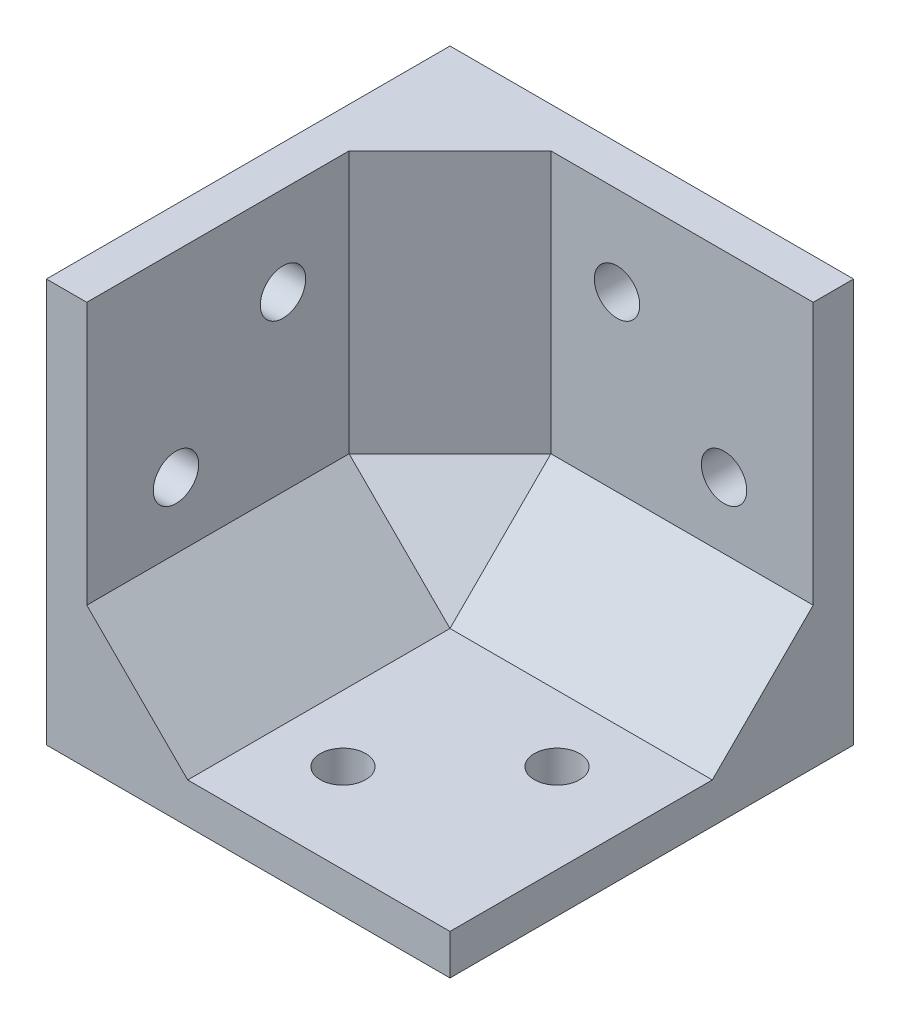
ISO-10303-21;
HEADER;
FILE_DESCRIPTION(('STEP AP214'),'2;1');
FILE_NAME('part.step','',(''),(''),'','','');
FILE_SCHEMA(('AUTOMOTIVE_DESIGN { 1 0 10303 214 1 1 1 1 }'));
ENDSEC;
DATA;
#1=APPLICATION_CONTEXT('core data for automotive mechanical design processes');
#2=APPLICATION_PROTOCOL_DEFINITION('international standard','automotive_design',2000,#1);
#3=PRODUCT_CONTEXT('',#1,'mechanical');
#4=PRODUCT('Part','Part','',(#3));
#5=PRODUCT_RELATED_PRODUCT_CATEGORY('part','',(#4));
#6=PRODUCT_DEFINITION_FORMATION('','',#4);
#7=PRODUCT_DEFINITION_CONTEXT('part definition',#1,'design');
#8=PRODUCT_DEFINITION('design','',#6,#7);
#9=PRODUCT_DEFINITION_SHAPE('','',#8);
#10=(LENGTH_UNIT() NAMED_UNIT(*) SI_UNIT(.MILLI.,.METRE.));
#11=(NAMED_UNIT(*) PLANE_ANGLE_UNIT() SI_UNIT($,.RADIAN.));
#12=(NAMED_UNIT(*) SI_UNIT($,.STERADIAN.) SOLID_ANGLE_UNIT());
#13=UNCERTAINTY_MEASURE_WITH_UNIT(LENGTH_MEASURE(1.E-05),#10,'distance_accuracy_value','');
#14=(GEOMETRIC_REPRESENTATION_CONTEXT(3) GLOBAL_UNCERTAINTY_ASSIGNED_CONTEXT((#13)) GLOBAL_UNIT_ASSIGNED_CONTEXT((#10,
#11,#12)) REPRESENTATION_CONTEXT('',''));
#15=CARTESIAN_POINT('',(0.,0.,0.));
#16=DIRECTION('',(0.,0.,1.));
#17=DIRECTION('',(1.,0.,0.));
#18=AXIS2_PLACEMENT_3D('',#15,#16,#17);
#19=CARTESIAN_POINT('',(0.,4.,0.));
#20=DIRECTION('',(-1.,0.,0.));
#21=DIRECTION('',(0.,0.,1.));
#22=AXIS2_PLACEMENT_3D('',#19,#20,#21);
#23=PLANE('',#22);
#24=DIRECTION('',(0.,0.,-1.));
#25=VECTOR('',#24,1.);
#26=CARTESIAN_POINT('',(0.,0.,0.));
#27=LINE('',#26,#25);
#28=CARTESIAN_POINT('',(0.,0.,0.));
#29=VERTEX_POINT('',#28);
#30=CARTESIAN_POINT('',(0.,0.,-40.));
#31=VERTEX_POINT('',#30);
#32=EDGE_CURVE('E136',#29,#31,#27,.T.);
#33=ORIENTED_EDGE('',*,*,#32,.T.);
#34=DIRECTION('',(0.,-1.,0.));
#35=VECTOR('',#34,1.);
#36=CARTESIAN_POINT('',(0.,4.,-40.));
#37=LINE('',#36,#35);
#38=CARTESIAN_POINT('',(0.,40.,-40.));
#39=VERTEX_POINT('',#38);
#40=EDGE_CURVE('E141',#39,#31,#37,.T.);
#41=ORIENTED_EDGE('',*,*,#40,.F.);
#42=DIRECTION('',(0.,0.,-1.));
#43=VECTOR('',#42,1.);
#44=CARTESIAN_POINT('',(0.,40.,-40.));
#45=LINE('',#44,#43);
#46=CARTESIAN_POINT('',(0.,40.,-36.));
#47=VERTEX_POINT('',#46);
#48=EDGE_CURVE('E122',#47,#39,#45,.T.);
#49=ORIENTED_EDGE('',*,*,#48,.F.);
#50=DIRECTION('',(0.,-1.,0.));
#51=VECTOR('',#50,1.);
#52=CARTESIAN_POINT('',(0.,40.,-36.));
#53=LINE('',#52,#51);
#54=CARTESIAN_POINT('',(0.,14.0000000000001,-36.));
#55=VERTEX_POINT('',#54);
#56=EDGE_CURVE('E131',#47,#55,#53,.T.);
#57=ORIENTED_EDGE('',*,*,#56,.T.);
#58=DIRECTION('',(0.,-0.707106781186551,0.707106781186544));
#59=VECTOR('',#58,1.);
#60=CARTESIAN_POINT('',(0.,-9.00000000000001,-13.0000000000002));
#61=LINE('',#60,#59);
#62=CARTESIAN_POINT('',(0.,4.,-26.));
#63=VERTEX_POINT('',#62);
#64=EDGE_CURVE('E185',#55,#63,#61,.T.);
#65=ORIENTED_EDGE('',*,*,#64,.T.);
#66=DIRECTION('',(0.,0.,-1.));
#67=VECTOR('',#66,1.);
#68=CARTESIAN_POINT('',(0.,4.,0.));
#69=LINE('',#68,#67);
#70=CARTESIAN_POINT('',(0.,4.,0.));
#71=VERTEX_POINT('',#70);
#72=EDGE_CURVE('E153',#71,#63,#69,.T.);
#73=ORIENTED_EDGE('',*,*,#72,.F.);
#74=DIRECTION('',(0.,-1.,0.));
#75=VECTOR('',#74,1.);
#76=CARTESIAN_POINT('',(0.,4.,0.));
#77=LINE('',#76,#75);
#78=EDGE_CURVE('E159',#71,#29,#77,.T.);
#79=ORIENTED_EDGE('',*,*,#78,.T.);
#80=EDGE_LOOP('',(#33,#41,#49,#57,#65,#73,#79));
#81=FACE_BOUND('',#80,.T.);
#82=ADVANCED_FACE('F39',(#81),#23,.F.);
#83=CARTESIAN_POINT('',(0.,4.,-40.));
#84=DIRECTION('',(0.,0.,1.));
#85=DIRECTION('',(1.,0.,0.));
#86=AXIS2_PLACEMENT_3D('',#83,#84,#85);
#87=PLANE('',#86);
#88=CARTESIAN_POINT('',(-8.83883476483184,20.5545635173699,-40.));
#89=DIRECTION('',(0.,0.,-1.));
#90=DIRECTION('',(-1.,0.,0.));
#91=AXIS2_PLACEMENT_3D('',#88,#89,#90);
#92=CIRCLE('',#91,2.24999999999999);
#93=CARTESIAN_POINT('',(-11.0888347648318,20.5545635173699,-40.));
#94=VERTEX_POINT('',#93);
#95=EDGE_CURVE('E220',#94,#94,#92,.T.);
#96=ORIENTED_EDGE('',*,*,#95,.F.);
#97=EDGE_LOOP('',(#96));
#98=FACE_BOUND('',#97,.T.);
#99=CARTESIAN_POINT('',(-19.4454364826301,31.1611652351681,-40.));
#100=DIRECTION('',(0.,0.,-1.));
#101=DIRECTION('',(-1.,0.,0.));
#102=AXIS2_PLACEMENT_3D('',#99,#100,#101);
#103=CIRCLE('',#102,2.24999999999999);
#104=CARTESIAN_POINT('',(-21.69543648263,31.1611652351681,-40.));
#105=VERTEX_POINT('',#104);
#106=EDGE_CURVE('E214',#105,#105,#103,.T.);
#107=ORIENTED_EDGE('',*,*,#106,.F.);
#108=EDGE_LOOP('',(#107));
#109=FACE_BOUND('',#108,.T.);
#110=DIRECTION('',(-1.,0.,0.));
#111=VECTOR('',#110,1.);
#112=CARTESIAN_POINT('',(0.,0.,-40.));
#113=LINE('',#112,#111);
#114=CARTESIAN_POINT('',(-40.,0.,-40.));
#115=VERTEX_POINT('',#114);
#116=EDGE_CURVE('E161',#31,#115,#113,.T.);
#117=ORIENTED_EDGE('',*,*,#116,.T.);
#118=DIRECTION('',(0.,-1.,0.));
#119=VECTOR('',#118,1.);
#120=CARTESIAN_POINT('',(-40.,4.,-40.));
#121=LINE('',#120,#119);
#122=CARTESIAN_POINT('',(-40.,40.,-40.));
#123=VERTEX_POINT('',#122);
#124=EDGE_CURVE('E171',#123,#115,#121,.T.);
#125=ORIENTED_EDGE('',*,*,#124,.F.);
#126=DIRECTION('',(-1.,0.,0.));
#127=VECTOR('',#126,1.);
#128=CARTESIAN_POINT('',(-40.,40.,-40.));
#129=LINE('',#128,#127);
#130=EDGE_CURVE('E142',#39,#123,#129,.T.);
#131=ORIENTED_EDGE('',*,*,#130,.F.);
#132=ORIENTED_EDGE('',*,*,#40,.T.);
#133=EDGE_LOOP('',(#117,#125,#131,#132));
#134=FACE_BOUND('',#133,.T.);
#135=ADVANCED_FACE('F243',(#98,#109,#134),#87,.F.);
#136=CARTESIAN_POINT('',(-40.,4.,0.));
#137=DIRECTION('',(1.,0.,0.));
#138=DIRECTION('',(0.,0.,-1.));
#139=AXIS2_PLACEMENT_3D('',#136,#137,#138);
#140=PLANE('',#139);
#141=CARTESIAN_POINT('',(-40.,31.1611652351681,-19.4454364826301));
#142=DIRECTION('',(-1.,0.,0.));
#143=DIRECTION('',(0.,0.,1.));
#144=AXIS2_PLACEMENT_3D('',#141,#142,#143);
#145=CIRCLE('',#144,2.24999999999999);
#146=CARTESIAN_POINT('',(-40.,31.1611652351681,-17.1954364826301));
#147=VERTEX_POINT('',#146);
#148=EDGE_CURVE('E232',#147,#147,#145,.T.);
#149=ORIENTED_EDGE('',*,*,#148,.F.);
#150=EDGE_LOOP('',(#149));
#151=FACE_BOUND('',#150,.T.);
#152=CARTESIAN_POINT('',(-40.,20.5545635173699,-8.83883476483184));
#153=DIRECTION('',(-1.,0.,0.));
#154=DIRECTION('',(0.,0.,1.));
#155=AXIS2_PLACEMENT_3D('',#152,#153,#154);
#156=CIRCLE('',#155,2.24999999999999);
#157=CARTESIAN_POINT('',(-40.,20.5545635173699,-6.58883476483185));
#158=VERTEX_POINT('',#157);
#159=EDGE_CURVE('E226',#158,#158,#156,.T.);
#160=ORIENTED_EDGE('',*,*,#159,.F.);
#161=EDGE_LOOP('',(#160));
#162=FACE_BOUND('',#161,.T.);
#163=DIRECTION('',(0.,0.,1.));
#164=VECTOR('',#163,1.);
#165=CARTESIAN_POINT('',(-40.,0.,0.));
#166=LINE('',#165,#164);
#167=CARTESIAN_POINT('',(-40.,0.,0.));
#168=VERTEX_POINT('',#167);
#169=EDGE_CURVE('E163',#115,#168,#166,.T.);
#170=ORIENTED_EDGE('',*,*,#169,.T.);
#171=DIRECTION('',(0.,-1.,0.));
#172=VECTOR('',#171,1.);
#173=CARTESIAN_POINT('',(-40.,4.,0.));
#174=LINE('',#173,#172);
#175=CARTESIAN_POINT('',(-40.,40.,0.));
#176=VERTEX_POINT('',#175);
#177=EDGE_CURVE('E168',#176,#168,#174,.T.);
#178=ORIENTED_EDGE('',*,*,#177,.F.);
#179=DIRECTION('',(0.,0.,1.));
#180=VECTOR('',#179,1.);
#181=CARTESIAN_POINT('',(-40.,40.,0.));
#182=LINE('',#181,#180);
#183=EDGE_CURVE('E144',#123,#176,#182,.T.);
#184=ORIENTED_EDGE('',*,*,#183,.F.);
#185=ORIENTED_EDGE('',*,*,#124,.T.);
#186=EDGE_LOOP('',(#170,#178,#184,#185));
#187=FACE_BOUND('',#186,.T.);
#188=ADVANCED_FACE('F239',(#151,#162,#187),#140,.F.);
#189=CARTESIAN_POINT('',(0.,4.,0.));
#190=DIRECTION('',(0.,0.,-1.));
#191=DIRECTION('',(-1.,0.,0.));
#192=AXIS2_PLACEMENT_3D('',#189,#190,#191);
#193=PLANE('',#192);
#194=DIRECTION('',(1.,0.,0.));
#195=VECTOR('',#194,1.);
#196=CARTESIAN_POINT('',(0.,0.,0.));
#197=LINE('',#196,#195);
#198=EDGE_CURVE('E157',#168,#29,#197,.T.);
#199=ORIENTED_EDGE('',*,*,#198,.T.);
#200=ORIENTED_EDGE('',*,*,#78,.F.);
#201=DIRECTION('',(1.,0.,0.));
#202=VECTOR('',#201,1.);
#203=CARTESIAN_POINT('',(0.,4.,0.));
#204=LINE('',#203,#202);
#205=CARTESIAN_POINT('',(-25.9999999999999,4.,0.));
#206=VERTEX_POINT('',#205);
#207=EDGE_CURVE('E156',#206,#71,#204,.T.);
#208=ORIENTED_EDGE('',*,*,#207,.F.);
#209=DIRECTION('',(-0.707106781186551,0.707106781186544,0.));
#210=VECTOR('',#209,1.);
#211=CARTESIAN_POINT('',(-12.9999999999998,-8.99999999999996,0.));
#212=LINE('',#211,#210);
#213=CARTESIAN_POINT('',(-36.,14.,0.));
#214=VERTEX_POINT('',#213);
#215=EDGE_CURVE('E49',#206,#214,#212,.T.);
#216=ORIENTED_EDGE('',*,*,#215,.T.);
#217=DIRECTION('',(0.,-1.,0.));
#218=VECTOR('',#217,1.);
#219=CARTESIAN_POINT('',(-36.,40.,0.));
#220=LINE('',#219,#218);
#221=CARTESIAN_POINT('',(-36.,40.,0.));
#222=VERTEX_POINT('',#221);
#223=EDGE_CURVE('E137',#222,#214,#220,.T.);
#224=ORIENTED_EDGE('',*,*,#223,.F.);
#225=DIRECTION('',(1.,0.,0.));
#226=VECTOR('',#225,1.);
#227=CARTESIAN_POINT('',(-36.,40.,0.));
#228=LINE('',#227,#226);
#229=EDGE_CURVE('E150',#176,#222,#228,.T.);
#230=ORIENTED_EDGE('',*,*,#229,.F.);
#231=ORIENTED_EDGE('',*,*,#177,.T.);
#232=EDGE_LOOP('',(#199,#200,#208,#216,#224,#230,#231));
#233=FACE_BOUND('',#232,.T.);
#234=ADVANCED_FACE('F242',(#233),#193,.F.);
#235=CARTESIAN_POINT('',(0.,4.,0.));
#236=DIRECTION('',(0.,1.,0.));
#237=DIRECTION('',(0.,0.,1.));
#238=AXIS2_PLACEMENT_3D('',#235,#236,#237);
#239=PLANE('',#238);
#240=CARTESIAN_POINT('',(-8.83883476483185,4.,-19.4454364826301));
#241=DIRECTION('',(0.,1.,0.));
#242=DIRECTION('',(0.,0.,1.));
#243=AXIS2_PLACEMENT_3D('',#240,#241,#242);
#244=CIRCLE('',#243,2.24999999999999);
#245=CARTESIAN_POINT('',(-8.83883476483185,4.,-17.1954364826301));
#246=VERTEX_POINT('',#245);
#247=EDGE_CURVE('E205',#246,#246,#244,.T.);
#248=ORIENTED_EDGE('',*,*,#247,.F.);
#249=EDGE_LOOP('',(#248));
#250=FACE_BOUND('',#249,.T.);
#251=CARTESIAN_POINT('',(-19.4454364826301,4.,-8.83883476483185));
#252=DIRECTION('',(0.,1.,0.));
#253=DIRECTION('',(0.,0.,1.));
#254=AXIS2_PLACEMENT_3D('',#251,#252,#253);
#255=CIRCLE('',#254,2.24999999999999);
#256=CARTESIAN_POINT('',(-19.4454364826301,4.,-6.58883476483186));
#257=VERTEX_POINT('',#256);
#258=EDGE_CURVE('E191',#257,#257,#255,.T.);
#259=ORIENTED_EDGE('',*,*,#258,.F.);
#260=EDGE_LOOP('',(#259));
#261=FACE_BOUND('',#260,.T.);
#262=ORIENTED_EDGE('',*,*,#72,.T.);
#263=DIRECTION('',(-1.,0.,0.));
#264=VECTOR('',#263,1.);
#265=CARTESIAN_POINT('',(0.,4.,-26.));
#266=LINE('',#265,#264);
#267=CARTESIAN_POINT('',(-25.9999999999999,4.,-26.));
#268=VERTEX_POINT('',#267);
#269=EDGE_CURVE('E180',#63,#268,#266,.T.);
#270=ORIENTED_EDGE('',*,*,#269,.T.);
#271=DIRECTION('',(0.,0.,1.));
#272=VECTOR('',#271,1.);
#273=CARTESIAN_POINT('',(-25.9999999999999,4.,0.));
#274=LINE('',#273,#272);
#275=EDGE_CURVE('E178',#268,#206,#274,.T.);
#276=ORIENTED_EDGE('',*,*,#275,.T.);
#277=ORIENTED_EDGE('',*,*,#207,.T.);
#278=EDGE_LOOP('',(#262,#270,#276,#277));
#279=FACE_BOUND('',#278,.T.);
#280=ADVANCED_FACE('F259',(#250,#261,#279),#239,.T.);
#281=CARTESIAN_POINT('',(0.,0.,0.));
#282=DIRECTION('',(0.,1.,0.));
#283=DIRECTION('',(0.,0.,1.));
#284=AXIS2_PLACEMENT_3D('',#281,#282,#283);
#285=PLANE('',#284);
#286=CARTESIAN_POINT('',(-8.83883476483185,0.,-19.4454364826301));
#287=DIRECTION('',(0.,-1.,0.));
#288=DIRECTION('',(0.,0.,-1.));
#289=AXIS2_PLACEMENT_3D('',#286,#287,#288);
#290=CIRCLE('',#289,2.24999999999999);
#291=CARTESIAN_POINT('',(-8.83883476483185,0.,-21.69543648263));
#292=VERTEX_POINT('',#291);
#293=EDGE_CURVE('E208',#292,#292,#290,.T.);
#294=ORIENTED_EDGE('',*,*,#293,.F.);
#295=EDGE_LOOP('',(#294));
#296=FACE_BOUND('',#295,.T.);
#297=CARTESIAN_POINT('',(-19.4454364826301,0.,-8.83883476483185));
#298=DIRECTION('',(0.,-1.,0.));
#299=DIRECTION('',(0.,0.,-1.));
#300=AXIS2_PLACEMENT_3D('',#297,#298,#299);
#301=CIRCLE('',#300,2.24999999999999);
#302=CARTESIAN_POINT('',(-19.4454364826301,0.,-11.0888347648318));
#303=VERTEX_POINT('',#302);
#304=EDGE_CURVE('E202',#303,#303,#301,.T.);
#305=ORIENTED_EDGE('',*,*,#304,.F.);
#306=EDGE_LOOP('',(#305));
#307=FACE_BOUND('',#306,.T.);
#308=ORIENTED_EDGE('',*,*,#32,.F.);
#309=ORIENTED_EDGE('',*,*,#198,.F.);
#310=ORIENTED_EDGE('',*,*,#169,.F.);
#311=ORIENTED_EDGE('',*,*,#116,.F.);
#312=EDGE_LOOP('',(#308,#309,#310,#311));
#313=FACE_BOUND('',#312,.T.);
#314=ADVANCED_FACE('F254',(#296,#307,#313),#285,.F.);
#315=CARTESIAN_POINT('',(-36.,40.,-36.));
#316=DIRECTION('',(-1.,0.,0.));
#317=DIRECTION('',(0.,0.,1.));
#318=AXIS2_PLACEMENT_3D('',#315,#316,#317);
#319=PLANE('',#318);
#320=CARTESIAN_POINT('',(-36.,31.1611652351681,-19.4454364826301));
#321=DIRECTION('',(-1.,0.,0.));
#322=DIRECTION('',(0.,0.,1.));
#323=AXIS2_PLACEMENT_3D('',#320,#321,#322);
#324=CIRCLE('',#323,2.24999999999999);
#325=CARTESIAN_POINT('',(-36.,31.1611652351681,-17.1954364826301));
#326=VERTEX_POINT('',#325);
#327=EDGE_CURVE('E229',#326,#326,#324,.T.);
#328=ORIENTED_EDGE('',*,*,#327,.T.);
#329=EDGE_LOOP('',(#328));
#330=FACE_BOUND('',#329,.T.);
#331=CARTESIAN_POINT('',(-36.,20.5545635173699,-8.83883476483184));
#332=DIRECTION('',(-1.,0.,0.));
#333=DIRECTION('',(0.,0.,1.));
#334=AXIS2_PLACEMENT_3D('',#331,#332,#333);
#335=CIRCLE('',#334,2.24999999999999);
#336=CARTESIAN_POINT('',(-36.,20.5545635173699,-6.58883476483185));
#337=VERTEX_POINT('',#336);
#338=EDGE_CURVE('E223',#337,#337,#335,.T.);
#339=ORIENTED_EDGE('',*,*,#338,.T.);
#340=EDGE_LOOP('',(#339));
#341=FACE_BOUND('',#340,.T.);
#342=ORIENTED_EDGE('',*,*,#223,.T.);
#343=DIRECTION('',(0.,0.,-1.));
#344=VECTOR('',#343,1.);
#345=CARTESIAN_POINT('',(-36.,14.,-36.));
#346=LINE('',#345,#344);
#347=CARTESIAN_POINT('',(-36.,14.,-26.));
#348=VERTEX_POINT('',#347);
#349=EDGE_CURVE('E57',#214,#348,#346,.T.);
#350=ORIENTED_EDGE('',*,*,#349,.T.);
#351=DIRECTION('',(0.,1.,0.));
#352=VECTOR('',#351,1.);
#353=CARTESIAN_POINT('',(-36.,40.,-26.));
#354=LINE('',#353,#352);
#355=CARTESIAN_POINT('',(-36.,40.,-26.));
#356=VERTEX_POINT('',#355);
#357=EDGE_CURVE('E182',#348,#356,#354,.T.);
#358=ORIENTED_EDGE('',*,*,#357,.T.);
#359=DIRECTION('',(0.,0.,-1.));
#360=VECTOR('',#359,1.);
#361=CARTESIAN_POINT('',(-36.,40.,-36.));
#362=LINE('',#361,#360);
#363=EDGE_CURVE('E127',#222,#356,#362,.T.);
#364=ORIENTED_EDGE('',*,*,#363,.F.);
#365=EDGE_LOOP('',(#342,#350,#358,#364));
#366=FACE_BOUND('',#365,.T.);
#367=ADVANCED_FACE('F297',(#330,#341,#366),#319,.F.);
#368=CARTESIAN_POINT('',(0.,40.,-36.));
#369=DIRECTION('',(0.,0.,-1.));
#370=DIRECTION('',(-1.,0.,0.));
#371=AXIS2_PLACEMENT_3D('',#368,#369,#370);
#372=PLANE('',#371);
#373=CARTESIAN_POINT('',(-8.83883476483184,20.5545635173699,-36.));
#374=DIRECTION('',(0.,0.,-1.));
#375=DIRECTION('',(-1.,0.,0.));
#376=AXIS2_PLACEMENT_3D('',#373,#374,#375);
#377=CIRCLE('',#376,2.24999999999999);
#378=CARTESIAN_POINT('',(-11.0888347648318,20.5545635173699,-36.));
#379=VERTEX_POINT('',#378);
#380=EDGE_CURVE('E217',#379,#379,#377,.T.);
#381=ORIENTED_EDGE('',*,*,#380,.T.);
#382=EDGE_LOOP('',(#381));
#383=FACE_BOUND('',#382,.T.);
#384=CARTESIAN_POINT('',(-19.4454364826301,31.1611652351681,-36.));
#385=DIRECTION('',(0.,0.,-1.));
#386=DIRECTION('',(-1.,0.,0.));
#387=AXIS2_PLACEMENT_3D('',#384,#385,#386);
#388=CIRCLE('',#387,2.24999999999999);
#389=CARTESIAN_POINT('',(-21.69543648263,31.1611652351681,-36.));
#390=VERTEX_POINT('',#389);
#391=EDGE_CURVE('E211',#390,#390,#388,.T.);
#392=ORIENTED_EDGE('',*,*,#391,.T.);
#393=EDGE_LOOP('',(#392));
#394=FACE_BOUND('',#393,.T.);
#395=DIRECTION('',(0.,-1.,0.));
#396=VECTOR('',#395,1.);
#397=CARTESIAN_POINT('',(-25.9999999999999,4.,-36.));
#398=LINE('',#397,#396);
#399=CARTESIAN_POINT('',(-25.9999999999999,40.,-36.));
#400=VERTEX_POINT('',#399);
#401=CARTESIAN_POINT('',(-25.9999999999999,14.0000000000001,-36.));
#402=VERTEX_POINT('',#401);
#403=EDGE_CURVE('E175',#400,#402,#398,.T.);
#404=ORIENTED_EDGE('',*,*,#403,.T.);
#405=DIRECTION('',(1.,0.,0.));
#406=VECTOR('',#405,1.);
#407=CARTESIAN_POINT('',(0.,14.0000000000001,-36.));
#408=LINE('',#407,#406);
#409=EDGE_CURVE('E134',#402,#55,#408,.T.);
#410=ORIENTED_EDGE('',*,*,#409,.T.);
#411=ORIENTED_EDGE('',*,*,#56,.F.);
#412=DIRECTION('',(1.,0.,0.));
#413=VECTOR('',#412,1.);
#414=CARTESIAN_POINT('',(0.,40.,-36.));
#415=LINE('',#414,#413);
#416=EDGE_CURVE('E116',#400,#47,#415,.T.);
#417=ORIENTED_EDGE('',*,*,#416,.F.);
#418=EDGE_LOOP('',(#404,#410,#411,#417));
#419=FACE_BOUND('',#418,.T.);
#420=ADVANCED_FACE('F132',(#383,#394,#419),#372,.F.);
#421=CARTESIAN_POINT('',(0.,40.,0.));
#422=DIRECTION('',(0.,-1.,0.));
#423=DIRECTION('',(0.,0.,-1.));
#424=AXIS2_PLACEMENT_3D('',#421,#422,#423);
#425=PLANE('',#424);
#426=ORIENTED_EDGE('',*,*,#363,.T.);
#427=DIRECTION('',(-0.707106781186551,0.,0.707106781186544));
#428=VECTOR('',#427,1.);
#429=CARTESIAN_POINT('',(-30.9999999999998,40.,-31.0000000000002));
#430=LINE('',#429,#428);
#431=EDGE_CURVE('E11',#356,#400,#430,.F.);
#432=ORIENTED_EDGE('',*,*,#431,.T.);
#433=ORIENTED_EDGE('',*,*,#416,.T.);
#434=ORIENTED_EDGE('',*,*,#48,.T.);
#435=ORIENTED_EDGE('',*,*,#130,.T.);
#436=ORIENTED_EDGE('',*,*,#183,.T.);
#437=ORIENTED_EDGE('',*,*,#229,.T.);
#438=EDGE_LOOP('',(#426,#432,#433,#434,#435,#436,#437));
#439=FACE_BOUND('',#438,.T.);
#440=ADVANCED_FACE('F119',(#439),#425,.F.);
#441=CARTESIAN_POINT('',(-36.,14.,-36.));
#442=DIRECTION('',(-0.707106781186544,-0.707106781186551,0.));
#443=DIRECTION('',(0.,0.,-1.));
#444=AXIS2_PLACEMENT_3D('',#441,#442,#443);
#445=PLANE('',#444);
#446=ORIENTED_EDGE('',*,*,#215,.F.);
#447=ORIENTED_EDGE('',*,*,#275,.F.);
#448=DIRECTION('',(0.707106781186551,-0.707106781186544,0.));
#449=VECTOR('',#448,1.);
#450=CARTESIAN_POINT('',(-25.9999999999999,4.,-26.));
#451=LINE('',#450,#449);
#452=EDGE_CURVE('E44',#348,#268,#451,.T.);
#453=ORIENTED_EDGE('',*,*,#452,.F.);
#454=ORIENTED_EDGE('',*,*,#349,.F.);
#455=EDGE_LOOP('',(#446,#447,#453,#454));
#456=FACE_BOUND('',#455,.T.);
#457=ADVANCED_FACE('F42',(#456),#445,.F.);
#458=CARTESIAN_POINT('',(-25.9999999999999,40.,-36.));
#459=DIRECTION('',(0.707106781186544,0.,0.707106781186551));
#460=DIRECTION('',(0.,1.,0.));
#461=AXIS2_PLACEMENT_3D('',#458,#459,#460);
#462=PLANE('',#461);
#463=ORIENTED_EDGE('',*,*,#431,.F.);
#464=ORIENTED_EDGE('',*,*,#357,.F.);
#465=DIRECTION('',(0.707106781186551,0.,-0.707106781186544));
#466=VECTOR('',#465,1.);
#467=CARTESIAN_POINT('',(-31.,14.,-31.));
#468=LINE('',#467,#466);
#469=EDGE_CURVE('E190',#402,#348,#468,.F.);
#470=ORIENTED_EDGE('',*,*,#469,.F.);
#471=ORIENTED_EDGE('',*,*,#403,.F.);
#472=EDGE_LOOP('',(#463,#464,#470,#471));
#473=FACE_BOUND('',#472,.T.);
#474=ADVANCED_FACE('F265',(#473),#462,.T.);
#475=CARTESIAN_POINT('',(-25.9999999999999,4.,-26.));
#476=DIRECTION('',(0.57735026918962,0.577350269189626,0.577350269189632));
#477=DIRECTION('',(0.,-0.707106781186551,0.707106781186544));
#478=AXIS2_PLACEMENT_3D('',#475,#476,#477);
#479=PLANE('',#478);
#480=ORIENTED_EDGE('',*,*,#469,.T.);
#481=ORIENTED_EDGE('',*,*,#452,.T.);
#482=DIRECTION('',(0.,0.707106781186551,-0.707106781186544));
#483=VECTOR('',#482,1.);
#484=CARTESIAN_POINT('',(-25.9999999999999,4.,-26.));
#485=LINE('',#484,#483);
#486=EDGE_CURVE('E188',#402,#268,#485,.F.);
#487=ORIENTED_EDGE('',*,*,#486,.F.);
#488=EDGE_LOOP('',(#480,#481,#487));
#489=FACE_BOUND('',#488,.T.);
#490=ADVANCED_FACE('F263',(#489),#479,.T.);
#491=CARTESIAN_POINT('',(0.,14.0000000000001,-36.));
#492=DIRECTION('',(0.,-0.707106781186544,-0.707106781186551));
#493=DIRECTION('',(1.,0.,0.));
#494=AXIS2_PLACEMENT_3D('',#491,#492,#493);
#495=PLANE('',#494);
#496=ORIENTED_EDGE('',*,*,#486,.T.);
#497=ORIENTED_EDGE('',*,*,#269,.F.);
#498=ORIENTED_EDGE('',*,*,#64,.F.);
#499=ORIENTED_EDGE('',*,*,#409,.F.);
#500=EDGE_LOOP('',(#496,#497,#498,#499));
#501=FACE_BOUND('',#500,.T.);
#502=ADVANCED_FACE('F262',(#501),#495,.F.);
#503=CARTESIAN_POINT('',(-19.4454364826301,0.,-8.83883476483185));
#504=DIRECTION('',(0.,-1.,0.));
#505=DIRECTION('',(0.,0.,-1.));
#506=AXIS2_PLACEMENT_3D('',#503,#504,#505);
#507=CYLINDRICAL_SURFACE('',#506,2.24999999999999);
#508=ORIENTED_EDGE('',*,*,#258,.T.);
#509=EDGE_LOOP('',(#508));
#510=FACE_BOUND('',#509,.T.);
#511=ORIENTED_EDGE('',*,*,#304,.T.);
#512=EDGE_LOOP('',(#511));
#513=FACE_BOUND('',#512,.T.);
#514=ADVANCED_FACE('F271',(#510,#513),#507,.F.);
#515=CARTESIAN_POINT('',(-8.83883476483185,0.,-19.4454364826301));
#516=DIRECTION('',(0.,-1.,0.));
#517=DIRECTION('',(0.,0.,-1.));
#518=AXIS2_PLACEMENT_3D('',#515,#516,#517);
#519=CYLINDRICAL_SURFACE('',#518,2.24999999999999);
#520=ORIENTED_EDGE('',*,*,#247,.T.);
#521=EDGE_LOOP('',(#520));
#522=FACE_BOUND('',#521,.T.);
#523=ORIENTED_EDGE('',*,*,#293,.T.);
#524=EDGE_LOOP('',(#523));
#525=FACE_BOUND('',#524,.T.);
#526=ADVANCED_FACE('F312',(#522,#525),#519,.F.);
#527=CARTESIAN_POINT('',(-19.4454364826301,31.1611652351681,-40.));
#528=DIRECTION('',(0.,0.,-1.));
#529=DIRECTION('',(-1.,0.,0.));
#530=AXIS2_PLACEMENT_3D('',#527,#528,#529);
#531=CYLINDRICAL_SURFACE('',#530,2.24999999999999);
#532=ORIENTED_EDGE('',*,*,#106,.T.);
#533=EDGE_LOOP('',(#532));
#534=FACE_BOUND('',#533,.T.);
#535=ORIENTED_EDGE('',*,*,#391,.F.);
#536=EDGE_LOOP('',(#535));
#537=FACE_BOUND('',#536,.T.);
#538=ADVANCED_FACE('F316',(#534,#537),#531,.F.);
#539=CARTESIAN_POINT('',(-8.83883476483184,20.5545635173699,-40.));
#540=DIRECTION('',(0.,0.,-1.));
#541=DIRECTION('',(-1.,0.,0.));
#542=AXIS2_PLACEMENT_3D('',#539,#540,#541);
#543=CYLINDRICAL_SURFACE('',#542,2.24999999999999);
#544=ORIENTED_EDGE('',*,*,#95,.T.);
#545=EDGE_LOOP('',(#544));
#546=FACE_BOUND('',#545,.T.);
#547=ORIENTED_EDGE('',*,*,#380,.F.);
#548=EDGE_LOOP('',(#547));
#549=FACE_BOUND('',#548,.T.);
#550=ADVANCED_FACE('F320',(#546,#549),#543,.F.);
#551=CARTESIAN_POINT('',(-40.,20.5545635173699,-8.83883476483184));
#552=DIRECTION('',(-1.,0.,0.));
#553=DIRECTION('',(0.,0.,1.));
#554=AXIS2_PLACEMENT_3D('',#551,#552,#553);
#555=CYLINDRICAL_SURFACE('',#554,2.24999999999999);
#556=ORIENTED_EDGE('',*,*,#159,.T.);
#557=EDGE_LOOP('',(#556));
#558=FACE_BOUND('',#557,.T.);
#559=ORIENTED_EDGE('',*,*,#338,.F.);
#560=EDGE_LOOP('',(#559));
#561=FACE_BOUND('',#560,.T.);
#562=ADVANCED_FACE('F324',(#558,#561),#555,.F.);
#563=CARTESIAN_POINT('',(-40.,31.1611652351681,-19.4454364826301));
#564=DIRECTION('',(-1.,0.,0.));
#565=DIRECTION('',(0.,0.,1.));
#566=AXIS2_PLACEMENT_3D('',#563,#564,#565);
#567=CYLINDRICAL_SURFACE('',#566,2.24999999999999);
#568=ORIENTED_EDGE('',*,*,#148,.T.);
#569=EDGE_LOOP('',(#568));
#570=FACE_BOUND('',#569,.T.);
#571=ORIENTED_EDGE('',*,*,#327,.F.);
#572=EDGE_LOOP('',(#571));
#573=FACE_BOUND('',#572,.T.);
#574=ADVANCED_FACE('F236',(#570,#573),#567,.F.);
#575=CLOSED_SHELL('',(#82,#135,#188,#234,#280,#314,#367,#420,#440,#457,#474,#490,#502,#514,#526,
#538,#550,#562,#574));
#576=MANIFOLD_SOLID_BREP('B2',#575);
#577=ADVANCED_BREP_SHAPE_REPRESENTATION('',(#18,#576),#14);
#578=SHAPE_DEFINITION_REPRESENTATION(#9,#577);
ENDSEC;
END-ISO-10303-21;
